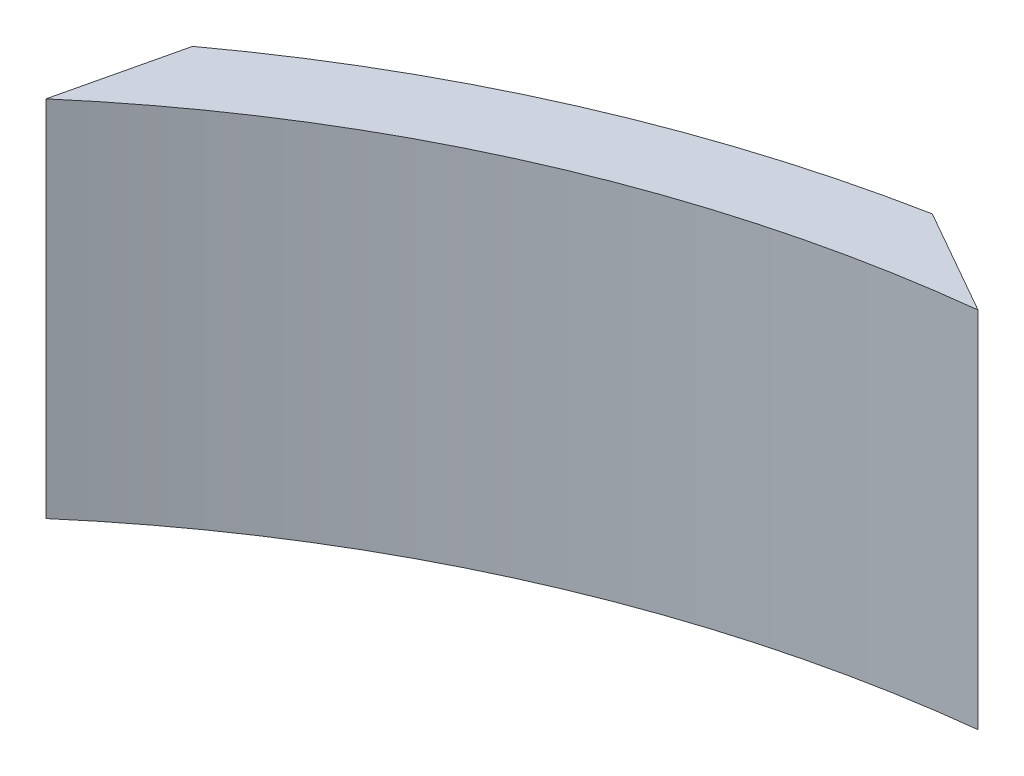
ISO-10303-21;
HEADER;
FILE_DESCRIPTION(('STEP AP214'),'2;1');
FILE_NAME('part.step','',(''),(''),'','','');
FILE_SCHEMA(('AUTOMOTIVE_DESIGN { 1 0 10303 214 1 1 1 1 }'));
ENDSEC;
DATA;
#1=APPLICATION_CONTEXT('core data for automotive mechanical design processes');
#2=APPLICATION_PROTOCOL_DEFINITION('international standard','automotive_design',2000,#1);
#3=PRODUCT_CONTEXT('',#1,'mechanical');
#4=PRODUCT('Part','Part','',(#3));
#5=PRODUCT_RELATED_PRODUCT_CATEGORY('part','',(#4));
#6=PRODUCT_DEFINITION_FORMATION('','',#4);
#7=PRODUCT_DEFINITION_CONTEXT('part definition',#1,'design');
#8=PRODUCT_DEFINITION('design','',#6,#7);
#9=PRODUCT_DEFINITION_SHAPE('','',#8);
#10=(LENGTH_UNIT() NAMED_UNIT(*) SI_UNIT(.MILLI.,.METRE.));
#11=(NAMED_UNIT(*) PLANE_ANGLE_UNIT() SI_UNIT($,.RADIAN.));
#12=(NAMED_UNIT(*) SI_UNIT($,.STERADIAN.) SOLID_ANGLE_UNIT());
#13=UNCERTAINTY_MEASURE_WITH_UNIT(LENGTH_MEASURE(1.E-05),#10,'distance_accuracy_value','');
#14=(GEOMETRIC_REPRESENTATION_CONTEXT(3) GLOBAL_UNCERTAINTY_ASSIGNED_CONTEXT((#13)) GLOBAL_UNIT_ASSIGNED_CONTEXT((#10,
#11,#12)) REPRESENTATION_CONTEXT('',''));
#15=CARTESIAN_POINT('',(0.,0.,0.));
#16=DIRECTION('',(0.,0.,1.));
#17=DIRECTION('',(1.,0.,0.));
#18=AXIS2_PLACEMENT_3D('',#15,#16,#17);
#19=CARTESIAN_POINT('',(-7.99999999999999,12.,71.5518867924529));
#20=DIRECTION('',(0.,-1.,0.));
#21=DIRECTION('',(0.,0.,-1.));
#22=AXIS2_PLACEMENT_3D('',#19,#20,#21);
#23=CYLINDRICAL_SURFACE('',#22,79.5518867924528);
#24=CARTESIAN_POINT('',(-7.99999999999999,-12.,71.5518867924529));
#25=DIRECTION('',(0.,-1.,0.));
#26=DIRECTION('',(0.,0.,-1.));
#27=AXIS2_PLACEMENT_3D('',#24,#25,#26);
#28=CIRCLE('',#27,79.5518867924528);
#29=CARTESIAN_POINT('',(-59.8389116550543,-12.,11.2092821862652));
#30=VERTEX_POINT('',#29);
#31=CARTESIAN_POINT('',(-17.,-12.,-7.48925877262124));
#32=VERTEX_POINT('',#31);
#33=EDGE_CURVE('E102',#30,#32,#28,.T.);
#34=ORIENTED_EDGE('',*,*,#33,.T.);
#35=DIRECTION('',(0.,-1.,0.));
#36=VECTOR('',#35,1.);
#37=CARTESIAN_POINT('',(-17.,12.,-7.48925877262124));
#38=LINE('',#37,#36);
#39=CARTESIAN_POINT('',(-17.,12.,-7.48925877262124));
#40=VERTEX_POINT('',#39);
#41=EDGE_CURVE('E11',#40,#32,#38,.T.);
#42=ORIENTED_EDGE('',*,*,#41,.F.);
#43=CARTESIAN_POINT('',(-7.99999999999999,12.,71.5518867924529));
#44=DIRECTION('',(0.,-1.,0.));
#45=DIRECTION('',(0.,0.,-1.));
#46=AXIS2_PLACEMENT_3D('',#43,#44,#45);
#47=CIRCLE('',#46,79.5518867924528);
#48=CARTESIAN_POINT('',(-59.8389116550543,12.,11.2092821862652));
#49=VERTEX_POINT('',#48);
#50=EDGE_CURVE('E90',#49,#40,#47,.T.);
#51=ORIENTED_EDGE('',*,*,#50,.F.);
#52=DIRECTION('',(0.,-1.,0.));
#53=VECTOR('',#52,1.);
#54=CARTESIAN_POINT('',(-59.8389116550543,12.,11.2092821862652));
#55=LINE('',#54,#53);
#56=EDGE_CURVE('E98',#49,#30,#55,.T.);
#57=ORIENTED_EDGE('',*,*,#56,.T.);
#58=EDGE_LOOP('',(#34,#42,#51,#57));
#59=FACE_BOUND('',#58,.T.);
#60=ADVANCED_FACE('F39',(#59),#23,.F.);
#61=CARTESIAN_POINT('',(-17.,12.,-7.48925877262124));
#62=DIRECTION('',(-0.4945541282444,0.,0.869146831229581));
#63=DIRECTION('',(0.869146831229581,0.,0.4945541282444));
#64=AXIS2_PLACEMENT_3D('',#61,#62,#63);
#65=PLANE('',#64);
#66=DIRECTION('',(-0.869146831229581,0.,-0.494554128244399));
#67=VECTOR('',#66,1.);
#68=CARTESIAN_POINT('',(-17.,-12.,-7.48925877262124));
#69=LINE('',#68,#67);
#70=CARTESIAN_POINT('',(-24.,-12.,-11.4723359390113));
#71=VERTEX_POINT('',#70);
#72=EDGE_CURVE('E94',#32,#71,#69,.T.);
#73=ORIENTED_EDGE('',*,*,#72,.T.);
#74=DIRECTION('',(0.,-1.,0.));
#75=VECTOR('',#74,1.);
#76=CARTESIAN_POINT('',(-24.,12.,-11.4723359390113));
#77=LINE('',#76,#75);
#78=CARTESIAN_POINT('',(-24.,12.,-11.4723359390113));
#79=VERTEX_POINT('',#78);
#80=EDGE_CURVE('E47',#79,#71,#77,.T.);
#81=ORIENTED_EDGE('',*,*,#80,.F.);
#82=DIRECTION('',(-0.869146831229581,0.,-0.494554128244399));
#83=VECTOR('',#82,1.);
#84=CARTESIAN_POINT('',(-17.,12.,-7.48925877262124));
#85=LINE('',#84,#83);
#86=EDGE_CURVE('E85',#40,#79,#85,.T.);
#87=ORIENTED_EDGE('',*,*,#86,.F.);
#88=ORIENTED_EDGE('',*,*,#41,.T.);
#89=EDGE_LOOP('',(#73,#81,#87,#88));
#90=FACE_BOUND('',#89,.T.);
#91=ADVANCED_FACE('F93',(#90),#65,.F.);
#92=CARTESIAN_POINT('',(-7.99999999999999,12.,71.5518867924529));
#93=DIRECTION('',(0.,-1.,0.));
#94=DIRECTION('',(0.,0.,-1.));
#95=AXIS2_PLACEMENT_3D('',#92,#93,#94);
#96=CYLINDRICAL_SURFACE('',#95,84.5518867924529);
#97=CARTESIAN_POINT('',(-7.99999999999999,-12.,71.5518867924529));
#98=DIRECTION('',(0.,1.,0.));
#99=DIRECTION('',(0.,0.,-1.));
#100=AXIS2_PLACEMENT_3D('',#97,#98,#99);
#101=CIRCLE('',#100,84.5518867924529);
#102=CARTESIAN_POINT('',(-58.,-12.,3.36815295392093));
#103=VERTEX_POINT('',#102);
#104=EDGE_CURVE('E72',#71,#103,#101,.T.);
#105=ORIENTED_EDGE('',*,*,#104,.T.);
#106=DIRECTION('',(0.,-1.,0.));
#107=VECTOR('',#106,1.);
#108=CARTESIAN_POINT('',(-58.,12.,3.36815295392093));
#109=LINE('',#108,#107);
#110=CARTESIAN_POINT('',(-58.,12.,3.36815295392093));
#111=VERTEX_POINT('',#110);
#112=EDGE_CURVE('E95',#111,#103,#109,.T.);
#113=ORIENTED_EDGE('',*,*,#112,.F.);
#114=CARTESIAN_POINT('',(-7.99999999999999,12.,71.5518867924529));
#115=DIRECTION('',(0.,1.,0.));
#116=DIRECTION('',(0.,0.,-1.));
#117=AXIS2_PLACEMENT_3D('',#114,#115,#116);
#118=CIRCLE('',#117,84.5518867924529);
#119=EDGE_CURVE('E88',#79,#111,#118,.T.);
#120=ORIENTED_EDGE('',*,*,#119,.F.);
#121=ORIENTED_EDGE('',*,*,#80,.T.);
#122=EDGE_LOOP('',(#105,#113,#120,#121));
#123=FACE_BOUND('',#122,.T.);
#124=ADVANCED_FACE('F96',(#123),#96,.T.);
#125=CARTESIAN_POINT('',(-58.,12.,3.36815295392093));
#126=DIRECTION('',(0.973584660793374,0.,0.22832631970023));
#127=DIRECTION('',(0.22832631970023,0.,-0.973584660793374));
#128=AXIS2_PLACEMENT_3D('',#125,#126,#127);
#129=PLANE('',#128);
#130=DIRECTION('',(-0.22832631970023,0.,0.973584660793374));
#131=VECTOR('',#130,1.);
#132=CARTESIAN_POINT('',(-58.,-12.,3.36815295392093));
#133=LINE('',#132,#131);
#134=EDGE_CURVE('E78',#103,#30,#133,.T.);
#135=ORIENTED_EDGE('',*,*,#134,.T.);
#136=ORIENTED_EDGE('',*,*,#56,.F.);
#137=DIRECTION('',(-0.22832631970023,0.,0.973584660793374));
#138=VECTOR('',#137,1.);
#139=CARTESIAN_POINT('',(-58.,12.,3.36815295392093));
#140=LINE('',#139,#138);
#141=EDGE_CURVE('E55',#111,#49,#140,.T.);
#142=ORIENTED_EDGE('',*,*,#141,.F.);
#143=ORIENTED_EDGE('',*,*,#112,.T.);
#144=EDGE_LOOP('',(#135,#136,#142,#143));
#145=FACE_BOUND('',#144,.T.);
#146=ADVANCED_FACE('F109',(#145),#129,.F.);
#147=CARTESIAN_POINT('',(-7.99999999999999,12.,71.5518867924529));
#148=DIRECTION('',(0.,-1.,0.));
#149=DIRECTION('',(0.,0.,-1.));
#150=AXIS2_PLACEMENT_3D('',#147,#148,#149);
#151=PLANE('',#150);
#152=ORIENTED_EDGE('',*,*,#50,.T.);
#153=ORIENTED_EDGE('',*,*,#86,.T.);
#154=ORIENTED_EDGE('',*,*,#119,.T.);
#155=ORIENTED_EDGE('',*,*,#141,.T.);
#156=EDGE_LOOP('',(#152,#153,#154,#155));
#157=FACE_BOUND('',#156,.T.);
#158=ADVANCED_FACE('F86',(#157),#151,.F.);
#159=CARTESIAN_POINT('',(-7.99999999999999,-12.,71.5518867924529));
#160=DIRECTION('',(0.,-1.,0.));
#161=DIRECTION('',(0.,0.,-1.));
#162=AXIS2_PLACEMENT_3D('',#159,#160,#161);
#163=PLANE('',#162);
#164=ORIENTED_EDGE('',*,*,#33,.F.);
#165=ORIENTED_EDGE('',*,*,#134,.F.);
#166=ORIENTED_EDGE('',*,*,#104,.F.);
#167=ORIENTED_EDGE('',*,*,#72,.F.);
#168=EDGE_LOOP('',(#164,#165,#166,#167));
#169=FACE_BOUND('',#168,.T.);
#170=ADVANCED_FACE('F112',(#169),#163,.T.);
#171=CLOSED_SHELL('',(#60,#91,#124,#146,#158,#170));
#172=MANIFOLD_SOLID_BREP('B2',#171);
#173=ADVANCED_BREP_SHAPE_REPRESENTATION('',(#18,#172),#14);
#174=SHAPE_DEFINITION_REPRESENTATION(#9,#173);
ENDSEC;
END-ISO-10303-21;
